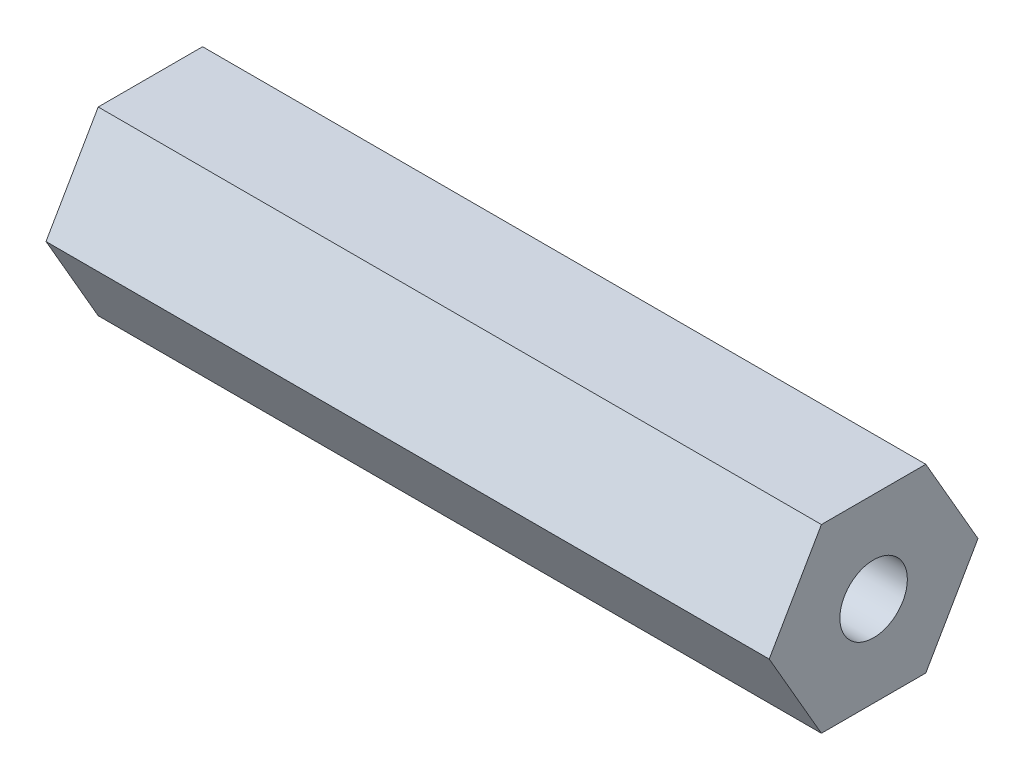
ISO-10303-21;
HEADER;
FILE_DESCRIPTION(('STEP AP214'),'2;1');
FILE_NAME('part.step','',(''),(''),'','','');
FILE_SCHEMA(('AUTOMOTIVE_DESIGN { 1 0 10303 214 1 1 1 1 }'));
ENDSEC;
DATA;
#1=APPLICATION_CONTEXT('core data for automotive mechanical design processes');
#2=APPLICATION_PROTOCOL_DEFINITION('international standard','automotive_design',2000,#1);
#3=PRODUCT_CONTEXT('',#1,'mechanical');
#4=PRODUCT('Part','Part','',(#3));
#5=PRODUCT_RELATED_PRODUCT_CATEGORY('part','',(#4));
#6=PRODUCT_DEFINITION_FORMATION('','',#4);
#7=PRODUCT_DEFINITION_CONTEXT('part definition',#1,'design');
#8=PRODUCT_DEFINITION('design','',#6,#7);
#9=PRODUCT_DEFINITION_SHAPE('','',#8);
#10=(LENGTH_UNIT() NAMED_UNIT(*) SI_UNIT(.MILLI.,.METRE.));
#11=(NAMED_UNIT(*) PLANE_ANGLE_UNIT() SI_UNIT($,.RADIAN.));
#12=(NAMED_UNIT(*) SI_UNIT($,.STERADIAN.) SOLID_ANGLE_UNIT());
#13=UNCERTAINTY_MEASURE_WITH_UNIT(LENGTH_MEASURE(1.E-05),#10,'distance_accuracy_value','');
#14=(GEOMETRIC_REPRESENTATION_CONTEXT(3) GLOBAL_UNCERTAINTY_ASSIGNED_CONTEXT((#13)) GLOBAL_UNIT_ASSIGNED_CONTEXT((#10,
#11,#12)) REPRESENTATION_CONTEXT('',''));
#15=CARTESIAN_POINT('',(0.,0.,0.));
#16=DIRECTION('',(0.,0.,1.));
#17=DIRECTION('',(1.,0.,0.));
#18=AXIS2_PLACEMENT_3D('',#15,#16,#17);
#19=CARTESIAN_POINT('',(19.05,0.,-2.74963065701559));
#20=DIRECTION('',(0.,0.5,0.866025403784439));
#21=DIRECTION('',(0.,0.866025403784438,-0.5));
#22=AXIS2_PLACEMENT_3D('',#19,#20,#21);
#23=PLANE('',#22);
#24=DIRECTION('',(0.,-0.866025403784438,0.5));
#25=VECTOR('',#24,1.);
#26=CARTESIAN_POINT('',(0.,0.,-2.74963065701559));
#27=LINE('',#26,#25);
#28=CARTESIAN_POINT('',(0.,0.,-2.74963065701559));
#29=VERTEX_POINT('',#28);
#30=CARTESIAN_POINT('',(0.,-2.38125,-1.3748153285078));
#31=VERTEX_POINT('',#30);
#32=EDGE_CURVE('E122',#29,#31,#27,.T.);
#33=ORIENTED_EDGE('',*,*,#32,.F.);
#34=DIRECTION('',(-1.,0.,0.));
#35=VECTOR('',#34,1.);
#36=CARTESIAN_POINT('',(19.05,0.,-2.74963065701559));
#37=LINE('',#36,#35);
#38=CARTESIAN_POINT('',(19.05,0.,-2.74963065701559));
#39=VERTEX_POINT('',#38);
#40=EDGE_CURVE('E121',#39,#29,#37,.T.);
#41=ORIENTED_EDGE('',*,*,#40,.F.);
#42=DIRECTION('',(0.,-0.866025403784438,0.5));
#43=VECTOR('',#42,1.);
#44=CARTESIAN_POINT('',(19.05,0.,-2.74963065701559));
#45=LINE('',#44,#43);
#46=CARTESIAN_POINT('',(19.05,-2.38125,-1.3748153285078));
#47=VERTEX_POINT('',#46);
#48=EDGE_CURVE('E135',#39,#47,#45,.T.);
#49=ORIENTED_EDGE('',*,*,#48,.T.);
#50=DIRECTION('',(-1.,0.,0.));
#51=VECTOR('',#50,1.);
#52=CARTESIAN_POINT('',(19.05,-2.38125,-1.3748153285078));
#53=LINE('',#52,#51);
#54=EDGE_CURVE('E11',#47,#31,#53,.T.);
#55=ORIENTED_EDGE('',*,*,#54,.T.);
#56=EDGE_LOOP('',(#33,#41,#49,#55));
#57=FACE_BOUND('',#56,.T.);
#58=ADVANCED_FACE('F39',(#57),#23,.F.);
#59=CARTESIAN_POINT('',(19.05,-2.38125,-1.3748153285078));
#60=DIRECTION('',(0.,1.,0.));
#61=DIRECTION('',(0.,0.,-1.));
#62=AXIS2_PLACEMENT_3D('',#59,#60,#61);
#63=PLANE('',#62);
#64=DIRECTION('',(0.,0.,1.));
#65=VECTOR('',#64,1.);
#66=CARTESIAN_POINT('',(0.,-2.38125,-1.3748153285078));
#67=LINE('',#66,#65);
#68=CARTESIAN_POINT('',(0.,-2.38125,1.3748153285078));
#69=VERTEX_POINT('',#68);
#70=EDGE_CURVE('E124',#31,#69,#67,.T.);
#71=ORIENTED_EDGE('',*,*,#70,.F.);
#72=ORIENTED_EDGE('',*,*,#54,.F.);
#73=DIRECTION('',(0.,0.,1.));
#74=VECTOR('',#73,1.);
#75=CARTESIAN_POINT('',(19.05,-2.38125,-1.3748153285078));
#76=LINE('',#75,#74);
#77=CARTESIAN_POINT('',(19.05,-2.38125,1.3748153285078));
#78=VERTEX_POINT('',#77);
#79=EDGE_CURVE('E87',#47,#78,#76,.T.);
#80=ORIENTED_EDGE('',*,*,#79,.T.);
#81=DIRECTION('',(-1.,0.,0.));
#82=VECTOR('',#81,1.);
#83=CARTESIAN_POINT('',(19.05,-2.38125,1.3748153285078));
#84=LINE('',#83,#82);
#85=EDGE_CURVE('E47',#78,#69,#84,.T.);
#86=ORIENTED_EDGE('',*,*,#85,.T.);
#87=EDGE_LOOP('',(#71,#72,#80,#86));
#88=FACE_BOUND('',#87,.T.);
#89=ADVANCED_FACE('F141',(#88),#63,.F.);
#90=CARTESIAN_POINT('',(19.05,-2.38125,1.3748153285078));
#91=DIRECTION('',(0.,0.5,-0.866025403784439));
#92=DIRECTION('',(0.,-0.866025403784438,-0.5));
#93=AXIS2_PLACEMENT_3D('',#90,#91,#92);
#94=PLANE('',#93);
#95=DIRECTION('',(0.,0.866025403784439,0.5));
#96=VECTOR('',#95,1.);
#97=CARTESIAN_POINT('',(0.,-2.38125,1.3748153285078));
#98=LINE('',#97,#96);
#99=CARTESIAN_POINT('',(0.,0.,2.74963065701559));
#100=VERTEX_POINT('',#99);
#101=EDGE_CURVE('E128',#69,#100,#98,.T.);
#102=ORIENTED_EDGE('',*,*,#101,.F.);
#103=ORIENTED_EDGE('',*,*,#85,.F.);
#104=DIRECTION('',(0.,0.866025403784439,0.5));
#105=VECTOR('',#104,1.);
#106=CARTESIAN_POINT('',(19.05,-2.38125,1.3748153285078));
#107=LINE('',#106,#105);
#108=CARTESIAN_POINT('',(19.05,0.,2.74963065701559));
#109=VERTEX_POINT('',#108);
#110=EDGE_CURVE('E115',#78,#109,#107,.T.);
#111=ORIENTED_EDGE('',*,*,#110,.T.);
#112=DIRECTION('',(-1.,0.,0.));
#113=VECTOR('',#112,1.);
#114=CARTESIAN_POINT('',(19.05,0.,2.74963065701559));
#115=LINE('',#114,#113);
#116=EDGE_CURVE('E109',#109,#100,#115,.T.);
#117=ORIENTED_EDGE('',*,*,#116,.T.);
#118=EDGE_LOOP('',(#102,#103,#111,#117));
#119=FACE_BOUND('',#118,.T.);
#120=ADVANCED_FACE('F170',(#119),#94,.F.);
#121=CARTESIAN_POINT('',(19.05,0.,2.74963065701559));
#122=DIRECTION('',(0.,-0.5,-0.866025403784438));
#123=DIRECTION('',(0.,-0.866025403784438,0.5));
#124=AXIS2_PLACEMENT_3D('',#121,#122,#123);
#125=PLANE('',#124);
#126=DIRECTION('',(0.,0.866025403784438,-0.5));
#127=VECTOR('',#126,1.);
#128=CARTESIAN_POINT('',(0.,0.,2.74963065701559));
#129=LINE('',#128,#127);
#130=CARTESIAN_POINT('',(0.,2.38125,1.37481532850779));
#131=VERTEX_POINT('',#130);
#132=EDGE_CURVE('E131',#100,#131,#129,.T.);
#133=ORIENTED_EDGE('',*,*,#132,.F.);
#134=ORIENTED_EDGE('',*,*,#116,.F.);
#135=DIRECTION('',(0.,0.866025403784438,-0.5));
#136=VECTOR('',#135,1.);
#137=CARTESIAN_POINT('',(19.05,0.,2.74963065701559));
#138=LINE('',#137,#136);
#139=CARTESIAN_POINT('',(19.05,2.38125,1.37481532850779));
#140=VERTEX_POINT('',#139);
#141=EDGE_CURVE('E99',#109,#140,#138,.T.);
#142=ORIENTED_EDGE('',*,*,#141,.T.);
#143=DIRECTION('',(-1.,0.,0.));
#144=VECTOR('',#143,1.);
#145=CARTESIAN_POINT('',(19.05,2.38125,1.37481532850779));
#146=LINE('',#145,#144);
#147=EDGE_CURVE('E104',#140,#131,#146,.T.);
#148=ORIENTED_EDGE('',*,*,#147,.T.);
#149=EDGE_LOOP('',(#133,#134,#142,#148));
#150=FACE_BOUND('',#149,.T.);
#151=ADVANCED_FACE('F112',(#150),#125,.F.);
#152=CARTESIAN_POINT('',(19.05,2.38125,1.37481532850779));
#153=DIRECTION('',(0.,-1.,0.));
#154=DIRECTION('',(0.,0.,1.));
#155=AXIS2_PLACEMENT_3D('',#152,#153,#154);
#156=PLANE('',#155);
#157=DIRECTION('',(0.,0.,-1.));
#158=VECTOR('',#157,1.);
#159=CARTESIAN_POINT('',(0.,2.38125,1.37481532850779));
#160=LINE('',#159,#158);
#161=CARTESIAN_POINT('',(0.,2.38125,-1.3748153285078));
#162=VERTEX_POINT('',#161);
#163=EDGE_CURVE('E106',#131,#162,#160,.T.);
#164=ORIENTED_EDGE('',*,*,#163,.F.);
#165=ORIENTED_EDGE('',*,*,#147,.F.);
#166=DIRECTION('',(0.,0.,-1.));
#167=VECTOR('',#166,1.);
#168=CARTESIAN_POINT('',(19.05,2.38125,1.37481532850779));
#169=LINE('',#168,#167);
#170=CARTESIAN_POINT('',(19.05,2.38125,-1.3748153285078));
#171=VERTEX_POINT('',#170);
#172=EDGE_CURVE('E95',#140,#171,#169,.T.);
#173=ORIENTED_EDGE('',*,*,#172,.T.);
#174=DIRECTION('',(-1.,0.,0.));
#175=VECTOR('',#174,1.);
#176=CARTESIAN_POINT('',(19.05,2.38125,-1.3748153285078));
#177=LINE('',#176,#175);
#178=EDGE_CURVE('E110',#171,#162,#177,.T.);
#179=ORIENTED_EDGE('',*,*,#178,.T.);
#180=EDGE_LOOP('',(#164,#165,#173,#179));
#181=FACE_BOUND('',#180,.T.);
#182=ADVANCED_FACE('F105',(#181),#156,.F.);
#183=CARTESIAN_POINT('',(19.05,2.38125,-1.3748153285078));
#184=DIRECTION('',(0.,-0.5,0.866025403784439));
#185=DIRECTION('',(0.,0.866025403784439,0.5));
#186=AXIS2_PLACEMENT_3D('',#183,#184,#185);
#187=PLANE('',#186);
#188=DIRECTION('',(0.,-0.866025403784439,-0.5));
#189=VECTOR('',#188,1.);
#190=CARTESIAN_POINT('',(0.,2.38125,-1.3748153285078));
#191=LINE('',#190,#189);
#192=EDGE_CURVE('E75',#162,#29,#191,.T.);
#193=ORIENTED_EDGE('',*,*,#192,.F.);
#194=ORIENTED_EDGE('',*,*,#178,.F.);
#195=DIRECTION('',(0.,-0.866025403784439,-0.5));
#196=VECTOR('',#195,1.);
#197=CARTESIAN_POINT('',(19.05,2.38125,-1.3748153285078));
#198=LINE('',#197,#196);
#199=EDGE_CURVE('E55',#171,#39,#198,.T.);
#200=ORIENTED_EDGE('',*,*,#199,.T.);
#201=ORIENTED_EDGE('',*,*,#40,.T.);
#202=EDGE_LOOP('',(#193,#194,#200,#201));
#203=FACE_BOUND('',#202,.T.);
#204=ADVANCED_FACE('F180',(#203),#187,.F.);
#205=CARTESIAN_POINT('',(19.05,0.,0.));
#206=DIRECTION('',(1.,0.,0.));
#207=DIRECTION('',(0.,0.,1.));
#208=AXIS2_PLACEMENT_3D('',#205,#206,#207);
#209=PLANE('',#208);
#210=CARTESIAN_POINT('',(19.05,0.,0.));
#211=DIRECTION('',(1.,0.,0.));
#212=DIRECTION('',(0.,0.,-1.));
#213=AXIS2_PLACEMENT_3D('',#210,#211,#212);
#214=CIRCLE('',#213,0.888999999999996);
#215=CARTESIAN_POINT('',(19.05,0.,-0.888999999999996));
#216=VERTEX_POINT('',#215);
#217=EDGE_CURVE('E125',#216,#216,#214,.T.);
#218=ORIENTED_EDGE('',*,*,#217,.F.);
#219=EDGE_LOOP('',(#218));
#220=FACE_BOUND('',#219,.T.);
#221=ORIENTED_EDGE('',*,*,#48,.F.);
#222=ORIENTED_EDGE('',*,*,#199,.F.);
#223=ORIENTED_EDGE('',*,*,#172,.F.);
#224=ORIENTED_EDGE('',*,*,#141,.F.);
#225=ORIENTED_EDGE('',*,*,#110,.F.);
#226=ORIENTED_EDGE('',*,*,#79,.F.);
#227=EDGE_LOOP('',(#221,#222,#223,#224,#225,#226));
#228=FACE_BOUND('',#227,.T.);
#229=ADVANCED_FACE('F97',(#220,#228),#209,.T.);
#230=CARTESIAN_POINT('',(0.,0.,0.));
#231=DIRECTION('',(1.,0.,0.));
#232=DIRECTION('',(0.,0.,1.));
#233=AXIS2_PLACEMENT_3D('',#230,#231,#232);
#234=PLANE('',#233);
#235=CARTESIAN_POINT('',(0.,0.,0.));
#236=DIRECTION('',(1.,0.,0.));
#237=DIRECTION('',(0.,0.,-1.));
#238=AXIS2_PLACEMENT_3D('',#235,#236,#237);
#239=CIRCLE('',#238,0.888999999999987);
#240=CARTESIAN_POINT('',(0.,0.,-0.888999999999987));
#241=VERTEX_POINT('',#240);
#242=EDGE_CURVE('E152',#241,#241,#239,.T.);
#243=ORIENTED_EDGE('',*,*,#242,.T.);
#244=EDGE_LOOP('',(#243));
#245=FACE_BOUND('',#244,.T.);
#246=ORIENTED_EDGE('',*,*,#32,.T.);
#247=ORIENTED_EDGE('',*,*,#70,.T.);
#248=ORIENTED_EDGE('',*,*,#101,.T.);
#249=ORIENTED_EDGE('',*,*,#132,.T.);
#250=ORIENTED_EDGE('',*,*,#163,.T.);
#251=ORIENTED_EDGE('',*,*,#192,.T.);
#252=EDGE_LOOP('',(#246,#247,#248,#249,#250,#251));
#253=FACE_BOUND('',#252,.T.);
#254=ADVANCED_FACE('F143',(#245,#253),#234,.F.);
#255=CARTESIAN_POINT('',(0.,0.,0.));
#256=DIRECTION('',(-1.,0.,0.));
#257=DIRECTION('',(0.,0.,-1.));
#258=AXIS2_PLACEMENT_3D('',#255,#256,#257);
#259=CYLINDRICAL_SURFACE('',#258,0.888999999999991);
#260=ORIENTED_EDGE('',*,*,#217,.T.);
#261=EDGE_LOOP('',(#260));
#262=FACE_BOUND('',#261,.T.);
#263=ORIENTED_EDGE('',*,*,#242,.F.);
#264=EDGE_LOOP('',(#263));
#265=FACE_BOUND('',#264,.T.);
#266=ADVANCED_FACE('F157',(#262,#265),#259,.F.);
#267=CLOSED_SHELL('',(#58,#89,#120,#151,#182,#204,#229,#254,#266));
#268=MANIFOLD_SOLID_BREP('B2',#267);
#269=ADVANCED_BREP_SHAPE_REPRESENTATION('',(#18,#268),#14);
#270=SHAPE_DEFINITION_REPRESENTATION(#9,#269);
ENDSEC;
END-ISO-10303-21;
